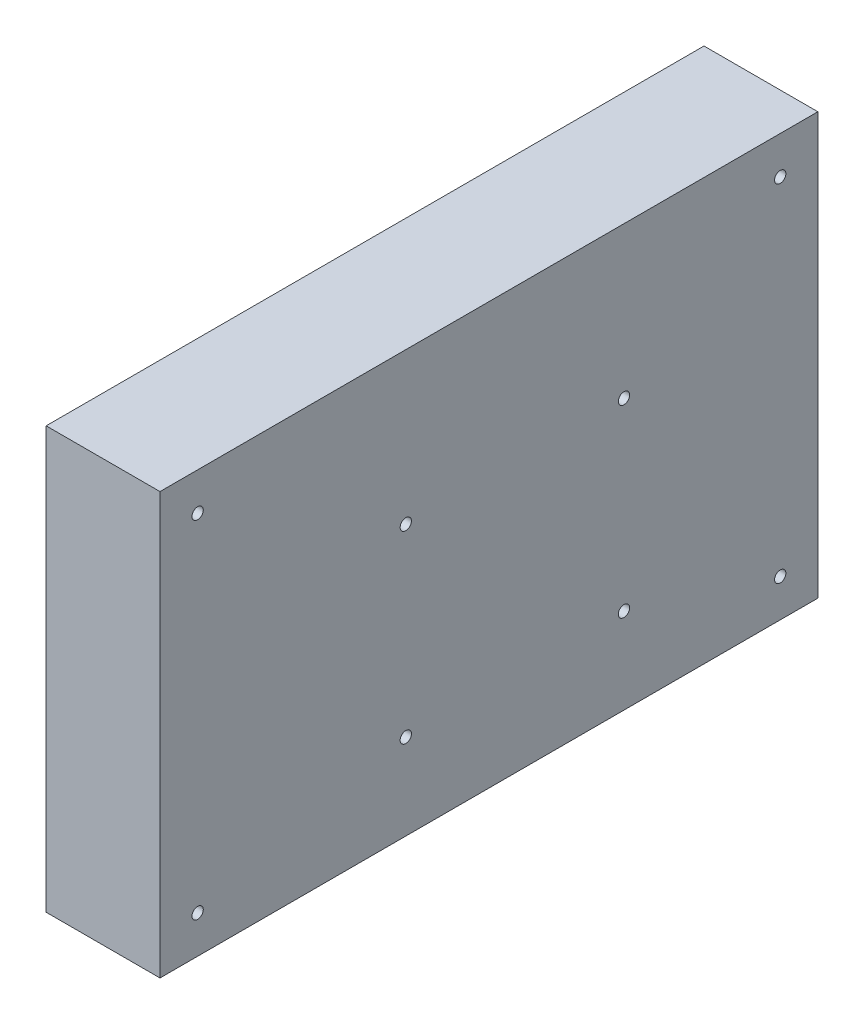
ISO-10303-21;
HEADER;
FILE_DESCRIPTION(('STEP AP214'),'2;1');
FILE_NAME('part.step','',(''),(''),'','','');
FILE_SCHEMA(('AUTOMOTIVE_DESIGN { 1 0 10303 214 1 1 1 1 }'));
ENDSEC;
DATA;
#1=APPLICATION_CONTEXT('core data for automotive mechanical design processes');
#2=APPLICATION_PROTOCOL_DEFINITION('international standard','automotive_design',2000,#1);
#3=PRODUCT_CONTEXT('',#1,'mechanical');
#4=PRODUCT('Part','Part','',(#3));
#5=PRODUCT_RELATED_PRODUCT_CATEGORY('part','',(#4));
#6=PRODUCT_DEFINITION_FORMATION('','',#4);
#7=PRODUCT_DEFINITION_CONTEXT('part definition',#1,'design');
#8=PRODUCT_DEFINITION('design','',#6,#7);
#9=PRODUCT_DEFINITION_SHAPE('','',#8);
#10=(LENGTH_UNIT() NAMED_UNIT(*) SI_UNIT(.MILLI.,.METRE.));
#11=(NAMED_UNIT(*) PLANE_ANGLE_UNIT() SI_UNIT($,.RADIAN.));
#12=(NAMED_UNIT(*) SI_UNIT($,.STERADIAN.) SOLID_ANGLE_UNIT());
#13=UNCERTAINTY_MEASURE_WITH_UNIT(LENGTH_MEASURE(1.E-05),#10,'distance_accuracy_value','');
#14=(GEOMETRIC_REPRESENTATION_CONTEXT(3) GLOBAL_UNCERTAINTY_ASSIGNED_CONTEXT((#13)) GLOBAL_UNIT_ASSIGNED_CONTEXT((#10,
#11,#12)) REPRESENTATION_CONTEXT('',''));
#15=CARTESIAN_POINT('',(0.,0.,0.));
#16=DIRECTION('',(0.,0.,1.));
#17=DIRECTION('',(1.,0.,0.));
#18=AXIS2_PLACEMENT_3D('',#15,#16,#17);
#19=CARTESIAN_POINT('',(29.27,46.,77.4450000000002));
#20=DIRECTION('',(-1.,0.,0.));
#21=DIRECTION('',(0.,0.,1.));
#22=AXIS2_PLACEMENT_3D('',#19,#20,#21);
#23=CYLINDRICAL_SURFACE('',#22,1.5);
#24=CARTESIAN_POINT('',(29.27,46.,77.4450000000002));
#25=DIRECTION('',(1.,0.,0.));
#26=DIRECTION('',(0.,0.,-1.));
#27=AXIS2_PLACEMENT_3D('',#24,#25,#26);
#28=CIRCLE('',#27,1.5);
#29=CARTESIAN_POINT('',(29.27,46.,75.9450000000002));
#30=VERTEX_POINT('',#29);
#31=EDGE_CURVE('E225',#30,#30,#28,.T.);
#32=ORIENTED_EDGE('',*,*,#31,.T.);
#33=EDGE_LOOP('',(#32));
#34=FACE_BOUND('',#33,.T.);
#35=CARTESIAN_POINT('',(25.27,46.,77.4450000000002));
#36=DIRECTION('',(-1.,0.,0.));
#37=DIRECTION('',(0.,0.,1.));
#38=AXIS2_PLACEMENT_3D('',#35,#36,#37);
#39=CIRCLE('',#38,1.5);
#40=CARTESIAN_POINT('',(25.27,46.,78.9450000000002));
#41=VERTEX_POINT('',#40);
#42=EDGE_CURVE('E194',#41,#41,#39,.T.);
#43=ORIENTED_EDGE('',*,*,#42,.T.);
#44=EDGE_LOOP('',(#43));
#45=FACE_BOUND('',#44,.T.);
#46=ADVANCED_FACE('F50',(#34,#45),#23,.F.);
#47=CARTESIAN_POINT('',(29.27,-46.,77.4450000000002));
#48=DIRECTION('',(-1.,0.,0.));
#49=DIRECTION('',(0.,0.,1.));
#50=AXIS2_PLACEMENT_3D('',#47,#48,#49);
#51=CYLINDRICAL_SURFACE('',#50,1.5);
#52=CARTESIAN_POINT('',(29.27,-46.,77.4450000000002));
#53=DIRECTION('',(1.,0.,0.));
#54=DIRECTION('',(0.,0.,-1.));
#55=AXIS2_PLACEMENT_3D('',#52,#53,#54);
#56=CIRCLE('',#55,1.5);
#57=CARTESIAN_POINT('',(29.27,-46.,75.9450000000002));
#58=VERTEX_POINT('',#57);
#59=EDGE_CURVE('E216',#58,#58,#56,.T.);
#60=ORIENTED_EDGE('',*,*,#59,.T.);
#61=EDGE_LOOP('',(#60));
#62=FACE_BOUND('',#61,.T.);
#63=CARTESIAN_POINT('',(25.27,-46.,77.4450000000002));
#64=DIRECTION('',(-1.,0.,0.));
#65=DIRECTION('',(0.,0.,1.));
#66=AXIS2_PLACEMENT_3D('',#63,#64,#65);
#67=CIRCLE('',#66,1.5);
#68=CARTESIAN_POINT('',(25.27,-46.,78.9450000000002));
#69=VERTEX_POINT('',#68);
#70=EDGE_CURVE('E190',#69,#69,#67,.T.);
#71=ORIENTED_EDGE('',*,*,#70,.T.);
#72=EDGE_LOOP('',(#71));
#73=FACE_BOUND('',#72,.T.);
#74=ADVANCED_FACE('F359',(#62,#73),#51,.F.);
#75=CARTESIAN_POINT('',(29.27,15.81,22.1));
#76=DIRECTION('',(-1.,0.,0.));
#77=DIRECTION('',(0.,0.,1.));
#78=AXIS2_PLACEMENT_3D('',#75,#76,#77);
#79=CYLINDRICAL_SURFACE('',#78,1.5);
#80=CARTESIAN_POINT('',(29.27,15.81,22.1));
#81=DIRECTION('',(1.,0.,0.));
#82=DIRECTION('',(0.,0.,-1.));
#83=AXIS2_PLACEMENT_3D('',#80,#81,#82);
#84=CIRCLE('',#83,1.5);
#85=CARTESIAN_POINT('',(29.27,15.81,20.6));
#86=VERTEX_POINT('',#85);
#87=EDGE_CURVE('E212',#86,#86,#84,.T.);
#88=ORIENTED_EDGE('',*,*,#87,.T.);
#89=EDGE_LOOP('',(#88));
#90=FACE_BOUND('',#89,.T.);
#91=CARTESIAN_POINT('',(25.27,15.81,22.1));
#92=DIRECTION('',(-1.,0.,0.));
#93=DIRECTION('',(0.,0.,1.));
#94=AXIS2_PLACEMENT_3D('',#91,#92,#93);
#95=CIRCLE('',#94,1.5);
#96=CARTESIAN_POINT('',(25.27,15.81,23.6));
#97=VERTEX_POINT('',#96);
#98=EDGE_CURVE('E182',#97,#97,#95,.T.);
#99=ORIENTED_EDGE('',*,*,#98,.T.);
#100=EDGE_LOOP('',(#99));
#101=FACE_BOUND('',#100,.T.);
#102=ADVANCED_FACE('F366',(#90,#101),#79,.F.);
#103=CARTESIAN_POINT('',(29.27,15.81,-35.8999999999999));
#104=DIRECTION('',(-1.,0.,0.));
#105=DIRECTION('',(0.,0.,1.));
#106=AXIS2_PLACEMENT_3D('',#103,#104,#105);
#107=CYLINDRICAL_SURFACE('',#106,1.5);
#108=CARTESIAN_POINT('',(29.27,15.81,-35.8999999999999));
#109=DIRECTION('',(1.,0.,0.));
#110=DIRECTION('',(0.,0.,-1.));
#111=AXIS2_PLACEMENT_3D('',#108,#109,#110);
#112=CIRCLE('',#111,1.5);
#113=CARTESIAN_POINT('',(29.27,15.81,-37.3999999999999));
#114=VERTEX_POINT('',#113);
#115=EDGE_CURVE('E214',#114,#114,#112,.T.);
#116=ORIENTED_EDGE('',*,*,#115,.T.);
#117=EDGE_LOOP('',(#116));
#118=FACE_BOUND('',#117,.T.);
#119=CARTESIAN_POINT('',(25.27,15.81,-35.8999999999999));
#120=DIRECTION('',(-1.,0.,0.));
#121=DIRECTION('',(0.,0.,1.));
#122=AXIS2_PLACEMENT_3D('',#119,#120,#121);
#123=CIRCLE('',#122,1.5);
#124=CARTESIAN_POINT('',(25.27,15.81,-34.3999999999999));
#125=VERTEX_POINT('',#124);
#126=EDGE_CURVE('E177',#125,#125,#123,.T.);
#127=ORIENTED_EDGE('',*,*,#126,.T.);
#128=EDGE_LOOP('',(#127));
#129=FACE_BOUND('',#128,.T.);
#130=ADVANCED_FACE('F444',(#118,#129),#107,.F.);
#131=CARTESIAN_POINT('',(29.27,-33.19,22.1));
#132=DIRECTION('',(-1.,0.,0.));
#133=DIRECTION('',(0.,0.,1.));
#134=AXIS2_PLACEMENT_3D('',#131,#132,#133);
#135=CYLINDRICAL_SURFACE('',#134,1.5);
#136=CARTESIAN_POINT('',(29.27,-33.19,22.1));
#137=DIRECTION('',(1.,0.,0.));
#138=DIRECTION('',(0.,0.,-1.));
#139=AXIS2_PLACEMENT_3D('',#136,#137,#138);
#140=CIRCLE('',#139,1.5);
#141=CARTESIAN_POINT('',(29.27,-33.19,20.6));
#142=VERTEX_POINT('',#141);
#143=EDGE_CURVE('E210',#142,#142,#140,.T.);
#144=ORIENTED_EDGE('',*,*,#143,.T.);
#145=EDGE_LOOP('',(#144));
#146=FACE_BOUND('',#145,.T.);
#147=CARTESIAN_POINT('',(25.27,-33.19,22.1));
#148=DIRECTION('',(-1.,0.,0.));
#149=DIRECTION('',(0.,0.,1.));
#150=AXIS2_PLACEMENT_3D('',#147,#148,#149);
#151=CIRCLE('',#150,1.5);
#152=CARTESIAN_POINT('',(25.27,-33.19,23.6));
#153=VERTEX_POINT('',#152);
#154=EDGE_CURVE('E174',#153,#153,#151,.T.);
#155=ORIENTED_EDGE('',*,*,#154,.T.);
#156=EDGE_LOOP('',(#155));
#157=FACE_BOUND('',#156,.T.);
#158=ADVANCED_FACE('F455',(#146,#157),#135,.F.);
#159=CARTESIAN_POINT('',(29.27,-33.19,-35.8999999999999));
#160=DIRECTION('',(-1.,0.,0.));
#161=DIRECTION('',(0.,0.,1.));
#162=AXIS2_PLACEMENT_3D('',#159,#160,#161);
#163=CYLINDRICAL_SURFACE('',#162,1.5);
#164=CARTESIAN_POINT('',(29.27,-33.19,-35.8999999999999));
#165=DIRECTION('',(1.,0.,0.));
#166=DIRECTION('',(0.,0.,-1.));
#167=AXIS2_PLACEMENT_3D('',#164,#165,#166);
#168=CIRCLE('',#167,1.5);
#169=CARTESIAN_POINT('',(29.27,-33.19,-37.3999999999999));
#170=VERTEX_POINT('',#169);
#171=EDGE_CURVE('E205',#170,#170,#168,.T.);
#172=ORIENTED_EDGE('',*,*,#171,.T.);
#173=EDGE_LOOP('',(#172));
#174=FACE_BOUND('',#173,.T.);
#175=CARTESIAN_POINT('',(25.27,-33.19,-35.8999999999999));
#176=DIRECTION('',(-1.,0.,0.));
#177=DIRECTION('',(0.,0.,1.));
#178=AXIS2_PLACEMENT_3D('',#175,#176,#177);
#179=CIRCLE('',#178,1.5);
#180=CARTESIAN_POINT('',(25.27,-33.19,-34.3999999999999));
#181=VERTEX_POINT('',#180);
#182=EDGE_CURVE('E171',#181,#181,#179,.T.);
#183=ORIENTED_EDGE('',*,*,#182,.T.);
#184=EDGE_LOOP('',(#183));
#185=FACE_BOUND('',#184,.T.);
#186=ADVANCED_FACE('F464',(#174,#185),#163,.F.);
#187=CARTESIAN_POINT('',(29.27,46.,-77.4449999999999));
#188=DIRECTION('',(-1.,0.,0.));
#189=DIRECTION('',(0.,0.,1.));
#190=AXIS2_PLACEMENT_3D('',#187,#188,#189);
#191=CYLINDRICAL_SURFACE('',#190,1.5);
#192=CARTESIAN_POINT('',(29.27,46.,-77.4449999999999));
#193=DIRECTION('',(1.,0.,0.));
#194=DIRECTION('',(0.,0.,-1.));
#195=AXIS2_PLACEMENT_3D('',#192,#193,#194);
#196=CIRCLE('',#195,1.5);
#197=CARTESIAN_POINT('',(29.27,46.,-78.9449999999999));
#198=VERTEX_POINT('',#197);
#199=EDGE_CURVE('E196',#198,#198,#196,.T.);
#200=ORIENTED_EDGE('',*,*,#199,.T.);
#201=EDGE_LOOP('',(#200));
#202=FACE_BOUND('',#201,.T.);
#203=CARTESIAN_POINT('',(25.27,46.,-77.4449999999999));
#204=DIRECTION('',(-1.,0.,0.));
#205=DIRECTION('',(0.,0.,1.));
#206=AXIS2_PLACEMENT_3D('',#203,#204,#205);
#207=CIRCLE('',#206,1.5);
#208=CARTESIAN_POINT('',(25.27,46.,-75.9449999999999));
#209=VERTEX_POINT('',#208);
#210=EDGE_CURVE('E170',#209,#209,#207,.T.);
#211=ORIENTED_EDGE('',*,*,#210,.T.);
#212=EDGE_LOOP('',(#211));
#213=FACE_BOUND('',#212,.T.);
#214=ADVANCED_FACE('F474',(#202,#213),#191,.F.);
#215=CARTESIAN_POINT('',(29.27,-46.,-77.4449999999999));
#216=DIRECTION('',(-1.,0.,0.));
#217=DIRECTION('',(0.,0.,1.));
#218=AXIS2_PLACEMENT_3D('',#215,#216,#217);
#219=CYLINDRICAL_SURFACE('',#218,1.49999999999995);
#220=CARTESIAN_POINT('',(29.27,-46.,-77.4449999999999));
#221=DIRECTION('',(1.,0.,0.));
#222=DIRECTION('',(0.,0.,-1.));
#223=AXIS2_PLACEMENT_3D('',#220,#221,#222);
#224=CIRCLE('',#223,1.49999999999995);
#225=CARTESIAN_POINT('',(29.27,-46.,-78.9449999999998));
#226=VERTEX_POINT('',#225);
#227=EDGE_CURVE('E192',#226,#226,#224,.T.);
#228=ORIENTED_EDGE('',*,*,#227,.T.);
#229=EDGE_LOOP('',(#228));
#230=FACE_BOUND('',#229,.T.);
#231=CARTESIAN_POINT('',(25.27,-46.,-77.4449999999999));
#232=DIRECTION('',(-1.,0.,0.));
#233=DIRECTION('',(0.,0.,1.));
#234=AXIS2_PLACEMENT_3D('',#231,#232,#233);
#235=CIRCLE('',#234,1.49999999999995);
#236=CARTESIAN_POINT('',(25.27,-46.,-75.9449999999999));
#237=VERTEX_POINT('',#236);
#238=EDGE_CURVE('E51',#237,#237,#235,.T.);
#239=ORIENTED_EDGE('',*,*,#238,.T.);
#240=EDGE_LOOP('',(#239));
#241=FACE_BOUND('',#240,.T.);
#242=ADVANCED_FACE('F478',(#230,#241),#219,.F.);
#243=CARTESIAN_POINT('',(14.27,56.,-87.45));
#244=DIRECTION('',(0.,0.,1.));
#245=DIRECTION('',(0.,-1.,0.));
#246=AXIS2_PLACEMENT_3D('',#243,#244,#245);
#247=PLANE('',#246);
#248=DIRECTION('',(-1.,0.,0.));
#249=VECTOR('',#248,1.);
#250=CARTESIAN_POINT('',(14.27,-56.,-87.45));
#251=LINE('',#250,#249);
#252=CARTESIAN_POINT('',(29.27,-56.,-87.45));
#253=VERTEX_POINT('',#252);
#254=CARTESIAN_POINT('',(-1.,-56.,-87.45));
#255=VERTEX_POINT('',#254);
#256=EDGE_CURVE('E324',#253,#255,#251,.T.);
#257=ORIENTED_EDGE('',*,*,#256,.T.);
#258=DIRECTION('',(0.,-1.,0.));
#259=VECTOR('',#258,1.);
#260=CARTESIAN_POINT('',(-1.,56.,-87.45));
#261=LINE('',#260,#259);
#262=CARTESIAN_POINT('',(-1.,56.,-87.45));
#263=VERTEX_POINT('',#262);
#264=EDGE_CURVE('E287',#263,#255,#261,.T.);
#265=ORIENTED_EDGE('',*,*,#264,.F.);
#266=DIRECTION('',(-1.,0.,0.));
#267=VECTOR('',#266,1.);
#268=CARTESIAN_POINT('',(14.27,56.,-87.45));
#269=LINE('',#268,#267);
#270=CARTESIAN_POINT('',(29.27,56.,-87.45));
#271=VERTEX_POINT('',#270);
#272=EDGE_CURVE('E11',#271,#263,#269,.T.);
#273=ORIENTED_EDGE('',*,*,#272,.F.);
#274=DIRECTION('',(0.,1.,0.));
#275=VECTOR('',#274,1.);
#276=CARTESIAN_POINT('',(29.27,56.,-87.45));
#277=LINE('',#276,#275);
#278=EDGE_CURVE('E232',#253,#271,#277,.T.);
#279=ORIENTED_EDGE('',*,*,#278,.F.);
#280=EDGE_LOOP('',(#257,#265,#273,#279));
#281=FACE_BOUND('',#280,.T.);
#282=ADVANCED_FACE('F47',(#281),#247,.F.);
#283=CARTESIAN_POINT('',(14.27,56.,-87.45));
#284=DIRECTION('',(0.,-1.,0.));
#285=DIRECTION('',(0.,0.,-1.));
#286=AXIS2_PLACEMENT_3D('',#283,#284,#285);
#287=PLANE('',#286);
#288=ORIENTED_EDGE('',*,*,#272,.T.);
#289=DIRECTION('',(0.,0.,-1.));
#290=VECTOR('',#289,1.);
#291=CARTESIAN_POINT('',(-1.,56.,-87.45));
#292=LINE('',#291,#290);
#293=CARTESIAN_POINT('',(-1.,56.,87.45));
#294=VERTEX_POINT('',#293);
#295=EDGE_CURVE('E296',#294,#263,#292,.T.);
#296=ORIENTED_EDGE('',*,*,#295,.F.);
#297=DIRECTION('',(-1.,0.,0.));
#298=VECTOR('',#297,1.);
#299=CARTESIAN_POINT('',(14.27,56.,87.45));
#300=LINE('',#299,#298);
#301=CARTESIAN_POINT('',(29.27,56.,87.45));
#302=VERTEX_POINT('',#301);
#303=EDGE_CURVE('E60',#302,#294,#300,.T.);
#304=ORIENTED_EDGE('',*,*,#303,.F.);
#305=DIRECTION('',(0.,0.,1.));
#306=VECTOR('',#305,1.);
#307=CARTESIAN_POINT('',(29.27,56.,87.45));
#308=LINE('',#307,#306);
#309=EDGE_CURVE('E237',#271,#302,#308,.T.);
#310=ORIENTED_EDGE('',*,*,#309,.F.);
#311=EDGE_LOOP('',(#288,#296,#304,#310));
#312=FACE_BOUND('',#311,.T.);
#313=ADVANCED_FACE('F338',(#312),#287,.F.);
#314=CARTESIAN_POINT('',(14.27,56.,87.45));
#315=DIRECTION('',(0.,0.,-1.));
#316=DIRECTION('',(0.,1.,0.));
#317=AXIS2_PLACEMENT_3D('',#314,#315,#316);
#318=PLANE('',#317);
#319=ORIENTED_EDGE('',*,*,#303,.T.);
#320=DIRECTION('',(0.,1.,0.));
#321=VECTOR('',#320,1.);
#322=CARTESIAN_POINT('',(-1.,56.,87.45));
#323=LINE('',#322,#321);
#324=CARTESIAN_POINT('',(-1.,-56.,87.45));
#325=VERTEX_POINT('',#324);
#326=EDGE_CURVE('E295',#325,#294,#323,.T.);
#327=ORIENTED_EDGE('',*,*,#326,.F.);
#328=DIRECTION('',(-1.,0.,0.));
#329=VECTOR('',#328,1.);
#330=CARTESIAN_POINT('',(14.27,-56.,87.45));
#331=LINE('',#330,#329);
#332=CARTESIAN_POINT('',(29.27,-56.,87.45));
#333=VERTEX_POINT('',#332);
#334=EDGE_CURVE('E323',#333,#325,#331,.T.);
#335=ORIENTED_EDGE('',*,*,#334,.F.);
#336=DIRECTION('',(0.,-1.,0.));
#337=VECTOR('',#336,1.);
#338=CARTESIAN_POINT('',(29.27,56.,87.45));
#339=LINE('',#338,#337);
#340=EDGE_CURVE('E227',#302,#333,#339,.T.);
#341=ORIENTED_EDGE('',*,*,#340,.F.);
#342=EDGE_LOOP('',(#319,#327,#335,#341));
#343=FACE_BOUND('',#342,.T.);
#344=ADVANCED_FACE('F332',(#343),#318,.F.);
#345=CARTESIAN_POINT('',(14.27,-56.,-87.45));
#346=DIRECTION('',(0.,1.,0.));
#347=DIRECTION('',(0.,0.,1.));
#348=AXIS2_PLACEMENT_3D('',#345,#346,#347);
#349=PLANE('',#348);
#350=ORIENTED_EDGE('',*,*,#334,.T.);
#351=DIRECTION('',(0.,0.,1.));
#352=VECTOR('',#351,1.);
#353=CARTESIAN_POINT('',(-1.,-56.,-87.45));
#354=LINE('',#353,#352);
#355=EDGE_CURVE('E288',#255,#325,#354,.T.);
#356=ORIENTED_EDGE('',*,*,#355,.F.);
#357=ORIENTED_EDGE('',*,*,#256,.F.);
#358=DIRECTION('',(0.,0.,-1.));
#359=VECTOR('',#358,1.);
#360=CARTESIAN_POINT('',(29.27,-56.,87.45));
#361=LINE('',#360,#359);
#362=EDGE_CURVE('E233',#333,#253,#361,.T.);
#363=ORIENTED_EDGE('',*,*,#362,.F.);
#364=EDGE_LOOP('',(#350,#356,#357,#363));
#365=FACE_BOUND('',#364,.T.);
#366=ADVANCED_FACE('F349',(#365),#349,.F.);
#367=CARTESIAN_POINT('',(14.27,52.,-83.45));
#368=DIRECTION('',(0.,0.,1.));
#369=DIRECTION('',(0.,-1.,0.));
#370=AXIS2_PLACEMENT_3D('',#367,#368,#369);
#371=PLANE('',#370);
#372=DIRECTION('',(0.,1.,0.));
#373=VECTOR('',#372,1.);
#374=CARTESIAN_POINT('',(0.,52.,-83.45));
#375=LINE('',#374,#373);
#376=CARTESIAN_POINT('',(0.,-52.,-83.45));
#377=VERTEX_POINT('',#376);
#378=CARTESIAN_POINT('',(0.,52.,-83.45));
#379=VERTEX_POINT('',#378);
#380=EDGE_CURVE('E63',#377,#379,#375,.T.);
#381=ORIENTED_EDGE('',*,*,#380,.F.);
#382=DIRECTION('',(-1.,0.,0.));
#383=VECTOR('',#382,1.);
#384=CARTESIAN_POINT('',(14.27,-52.,-83.45));
#385=LINE('',#384,#383);
#386=CARTESIAN_POINT('',(25.27,-52.,-83.45));
#387=VERTEX_POINT('',#386);
#388=EDGE_CURVE('E137',#387,#377,#385,.T.);
#389=ORIENTED_EDGE('',*,*,#388,.F.);
#390=DIRECTION('',(0.,-1.,0.));
#391=VECTOR('',#390,1.);
#392=CARTESIAN_POINT('',(25.27,52.,-83.45));
#393=LINE('',#392,#391);
#394=CARTESIAN_POINT('',(25.27,52.,-83.45));
#395=VERTEX_POINT('',#394);
#396=EDGE_CURVE('E138',#395,#387,#393,.T.);
#397=ORIENTED_EDGE('',*,*,#396,.F.);
#398=DIRECTION('',(-1.,0.,0.));
#399=VECTOR('',#398,1.);
#400=CARTESIAN_POINT('',(14.27,52.,-83.45));
#401=LINE('',#400,#399);
#402=EDGE_CURVE('E319',#395,#379,#401,.T.);
#403=ORIENTED_EDGE('',*,*,#402,.T.);
#404=EDGE_LOOP('',(#381,#389,#397,#403));
#405=FACE_BOUND('',#404,.T.);
#406=ADVANCED_FACE('F140',(#405),#371,.T.);
#407=CARTESIAN_POINT('',(14.27,52.,-83.45));
#408=DIRECTION('',(0.,-1.,0.));
#409=DIRECTION('',(0.,0.,-1.));
#410=AXIS2_PLACEMENT_3D('',#407,#408,#409);
#411=PLANE('',#410);
#412=DIRECTION('',(0.,0.,1.));
#413=VECTOR('',#412,1.);
#414=CARTESIAN_POINT('',(0.,52.,-83.45));
#415=LINE('',#414,#413);
#416=CARTESIAN_POINT('',(0.,52.,83.45));
#417=VERTEX_POINT('',#416);
#418=EDGE_CURVE('E302',#379,#417,#415,.T.);
#419=ORIENTED_EDGE('',*,*,#418,.F.);
#420=ORIENTED_EDGE('',*,*,#402,.F.);
#421=DIRECTION('',(0.,0.,-1.));
#422=VECTOR('',#421,1.);
#423=CARTESIAN_POINT('',(25.27,52.,-83.45));
#424=LINE('',#423,#422);
#425=CARTESIAN_POINT('',(25.27,52.,83.45));
#426=VERTEX_POINT('',#425);
#427=EDGE_CURVE('E156',#426,#395,#424,.T.);
#428=ORIENTED_EDGE('',*,*,#427,.F.);
#429=DIRECTION('',(-1.,0.,0.));
#430=VECTOR('',#429,1.);
#431=CARTESIAN_POINT('',(14.27,52.,83.45));
#432=LINE('',#431,#430);
#433=EDGE_CURVE('E74',#426,#417,#432,.T.);
#434=ORIENTED_EDGE('',*,*,#433,.T.);
#435=EDGE_LOOP('',(#419,#420,#428,#434));
#436=FACE_BOUND('',#435,.T.);
#437=ADVANCED_FACE('F358',(#436),#411,.T.);
#438=CARTESIAN_POINT('',(14.27,52.,83.45));
#439=DIRECTION('',(0.,0.,-1.));
#440=DIRECTION('',(0.,1.,0.));
#441=AXIS2_PLACEMENT_3D('',#438,#439,#440);
#442=PLANE('',#441);
#443=DIRECTION('',(0.,-1.,0.));
#444=VECTOR('',#443,1.);
#445=CARTESIAN_POINT('',(0.,52.,83.45));
#446=LINE('',#445,#444);
#447=CARTESIAN_POINT('',(0.,-52.,83.45));
#448=VERTEX_POINT('',#447);
#449=EDGE_CURVE('E308',#417,#448,#446,.T.);
#450=ORIENTED_EDGE('',*,*,#449,.F.);
#451=ORIENTED_EDGE('',*,*,#433,.F.);
#452=DIRECTION('',(0.,1.,0.));
#453=VECTOR('',#452,1.);
#454=CARTESIAN_POINT('',(25.27,52.,83.45));
#455=LINE('',#454,#453);
#456=CARTESIAN_POINT('',(25.27,-52.,83.45));
#457=VERTEX_POINT('',#456);
#458=EDGE_CURVE('E157',#457,#426,#455,.T.);
#459=ORIENTED_EDGE('',*,*,#458,.F.);
#460=DIRECTION('',(-1.,0.,0.));
#461=VECTOR('',#460,1.);
#462=CARTESIAN_POINT('',(14.27,-52.,83.45));
#463=LINE('',#462,#461);
#464=EDGE_CURVE('E143',#457,#448,#463,.T.);
#465=ORIENTED_EDGE('',*,*,#464,.T.);
#466=EDGE_LOOP('',(#450,#451,#459,#465));
#467=FACE_BOUND('',#466,.T.);
#468=ADVANCED_FACE('F400',(#467),#442,.T.);
#469=CARTESIAN_POINT('',(14.27,-52.,-83.45));
#470=DIRECTION('',(0.,1.,0.));
#471=DIRECTION('',(0.,0.,1.));
#472=AXIS2_PLACEMENT_3D('',#469,#470,#471);
#473=PLANE('',#472);
#474=DIRECTION('',(0.,0.,-1.));
#475=VECTOR('',#474,1.);
#476=CARTESIAN_POINT('',(0.,-52.,-83.45));
#477=LINE('',#476,#475);
#478=EDGE_CURVE('E149',#448,#377,#477,.T.);
#479=ORIENTED_EDGE('',*,*,#478,.F.);
#480=ORIENTED_EDGE('',*,*,#464,.F.);
#481=DIRECTION('',(0.,0.,1.));
#482=VECTOR('',#481,1.);
#483=CARTESIAN_POINT('',(25.27,-52.,-83.45));
#484=LINE('',#483,#482);
#485=EDGE_CURVE('E148',#387,#457,#484,.T.);
#486=ORIENTED_EDGE('',*,*,#485,.F.);
#487=ORIENTED_EDGE('',*,*,#388,.T.);
#488=EDGE_LOOP('',(#479,#480,#486,#487));
#489=FACE_BOUND('',#488,.T.);
#490=ADVANCED_FACE('F147',(#489),#473,.T.);
#491=CARTESIAN_POINT('',(0.,0.,0.));
#492=DIRECTION('',(-1.,0.,0.));
#493=DIRECTION('',(0.,0.,1.));
#494=AXIS2_PLACEMENT_3D('',#491,#492,#493);
#495=PLANE('',#494);
#496=DIRECTION('',(0.,-1.,0.));
#497=VECTOR('',#496,1.);
#498=CARTESIAN_POINT('',(0.,49.125,-80.45));
#499=LINE('',#498,#497);
#500=CARTESIAN_POINT('',(0.,49.125,-80.45));
#501=VERTEX_POINT('',#500);
#502=CARTESIAN_POINT('',(0.,-49.249406291834,-80.45));
#503=VERTEX_POINT('',#502);
#504=EDGE_CURVE('E243',#501,#503,#499,.T.);
#505=ORIENTED_EDGE('',*,*,#504,.T.);
#506=DIRECTION('',(0.,0.,1.));
#507=VECTOR('',#506,1.);
#508=CARTESIAN_POINT('',(0.,-49.249406291834,-80.45));
#509=LINE('',#508,#507);
#510=CARTESIAN_POINT('',(0.,-49.249406291834,80.45));
#511=VERTEX_POINT('',#510);
#512=EDGE_CURVE('E265',#503,#511,#509,.T.);
#513=ORIENTED_EDGE('',*,*,#512,.T.);
#514=DIRECTION('',(0.,1.,0.));
#515=VECTOR('',#514,1.);
#516=CARTESIAN_POINT('',(0.,49.125,80.45));
#517=LINE('',#516,#515);
#518=CARTESIAN_POINT('',(0.,49.125,80.45));
#519=VERTEX_POINT('',#518);
#520=EDGE_CURVE('E267',#511,#519,#517,.T.);
#521=ORIENTED_EDGE('',*,*,#520,.T.);
#522=DIRECTION('',(0.,0.,-1.));
#523=VECTOR('',#522,1.);
#524=CARTESIAN_POINT('',(0.,49.125,-80.45));
#525=LINE('',#524,#523);
#526=EDGE_CURVE('E247',#519,#501,#525,.T.);
#527=ORIENTED_EDGE('',*,*,#526,.T.);
#528=EDGE_LOOP('',(#505,#513,#521,#527));
#529=FACE_BOUND('',#528,.T.);
#530=ORIENTED_EDGE('',*,*,#449,.T.);
#531=ORIENTED_EDGE('',*,*,#478,.T.);
#532=ORIENTED_EDGE('',*,*,#380,.T.);
#533=ORIENTED_EDGE('',*,*,#418,.T.);
#534=EDGE_LOOP('',(#530,#531,#532,#533));
#535=FACE_BOUND('',#534,.T.);
#536=ADVANCED_FACE('F395',(#529,#535),#495,.F.);
#537=CARTESIAN_POINT('',(-1.,0.,0.));
#538=DIRECTION('',(-1.,0.,0.));
#539=DIRECTION('',(0.,0.,1.));
#540=AXIS2_PLACEMENT_3D('',#537,#538,#539);
#541=PLANE('',#540);
#542=ORIENTED_EDGE('',*,*,#264,.T.);
#543=ORIENTED_EDGE('',*,*,#355,.T.);
#544=ORIENTED_EDGE('',*,*,#326,.T.);
#545=ORIENTED_EDGE('',*,*,#295,.T.);
#546=EDGE_LOOP('',(#542,#543,#544,#545));
#547=FACE_BOUND('',#546,.T.);
#548=DIRECTION('',(0.,0.,1.));
#549=VECTOR('',#548,1.);
#550=CARTESIAN_POINT('',(-1.,-49.249406291834,-80.45));
#551=LINE('',#550,#549);
#552=CARTESIAN_POINT('',(-1.,-49.249406291834,-80.45));
#553=VERTEX_POINT('',#552);
#554=CARTESIAN_POINT('',(-1.,-49.249406291834,80.45));
#555=VERTEX_POINT('',#554);
#556=EDGE_CURVE('E250',#553,#555,#551,.T.);
#557=ORIENTED_EDGE('',*,*,#556,.F.);
#558=DIRECTION('',(0.,-1.,0.));
#559=VECTOR('',#558,1.);
#560=CARTESIAN_POINT('',(-1.,49.125,-80.45));
#561=LINE('',#560,#559);
#562=CARTESIAN_POINT('',(-1.,49.125,-80.45));
#563=VERTEX_POINT('',#562);
#564=EDGE_CURVE('E242',#563,#553,#561,.T.);
#565=ORIENTED_EDGE('',*,*,#564,.F.);
#566=DIRECTION('',(0.,0.,-1.));
#567=VECTOR('',#566,1.);
#568=CARTESIAN_POINT('',(-1.,49.125,-80.45));
#569=LINE('',#568,#567);
#570=CARTESIAN_POINT('',(-1.,49.125,80.45));
#571=VERTEX_POINT('',#570);
#572=EDGE_CURVE('E253',#571,#563,#569,.T.);
#573=ORIENTED_EDGE('',*,*,#572,.F.);
#574=DIRECTION('',(0.,1.,0.));
#575=VECTOR('',#574,1.);
#576=CARTESIAN_POINT('',(-1.,49.125,80.45));
#577=LINE('',#576,#575);
#578=EDGE_CURVE('E252',#555,#571,#577,.T.);
#579=ORIENTED_EDGE('',*,*,#578,.F.);
#580=EDGE_LOOP('',(#557,#565,#573,#579));
#581=FACE_BOUND('',#580,.T.);
#582=ADVANCED_FACE('F337',(#547,#581),#541,.T.);
#583=CARTESIAN_POINT('',(-1.,49.125,-80.45));
#584=DIRECTION('',(0.,0.,1.));
#585=DIRECTION('',(0.,-1.,0.));
#586=AXIS2_PLACEMENT_3D('',#583,#584,#585);
#587=PLANE('',#586);
#588=ORIENTED_EDGE('',*,*,#504,.F.);
#589=DIRECTION('',(1.,0.,0.));
#590=VECTOR('',#589,1.);
#591=CARTESIAN_POINT('',(-1.,49.125,-80.45));
#592=LINE('',#591,#590);
#593=EDGE_CURVE('E260',#563,#501,#592,.T.);
#594=ORIENTED_EDGE('',*,*,#593,.F.);
#595=ORIENTED_EDGE('',*,*,#564,.T.);
#596=DIRECTION('',(1.,0.,0.));
#597=VECTOR('',#596,1.);
#598=CARTESIAN_POINT('',(-1.,-49.249406291834,-80.45));
#599=LINE('',#598,#597);
#600=EDGE_CURVE('E285',#553,#503,#599,.T.);
#601=ORIENTED_EDGE('',*,*,#600,.T.);
#602=EDGE_LOOP('',(#588,#594,#595,#601));
#603=FACE_BOUND('',#602,.T.);
#604=ADVANCED_FACE('F383',(#603),#587,.T.);
#605=CARTESIAN_POINT('',(-1.,-49.249406291834,-80.45));
#606=DIRECTION('',(0.,1.,0.));
#607=DIRECTION('',(0.,0.,1.));
#608=AXIS2_PLACEMENT_3D('',#605,#606,#607);
#609=PLANE('',#608);
#610=ORIENTED_EDGE('',*,*,#512,.F.);
#611=ORIENTED_EDGE('',*,*,#600,.F.);
#612=ORIENTED_EDGE('',*,*,#556,.T.);
#613=DIRECTION('',(1.,0.,0.));
#614=VECTOR('',#613,1.);
#615=CARTESIAN_POINT('',(-1.,-49.249406291834,80.45));
#616=LINE('',#615,#614);
#617=EDGE_CURVE('E278',#555,#511,#616,.T.);
#618=ORIENTED_EDGE('',*,*,#617,.T.);
#619=EDGE_LOOP('',(#610,#611,#612,#618));
#620=FACE_BOUND('',#619,.T.);
#621=ADVANCED_FACE('F382',(#620),#609,.T.);
#622=CARTESIAN_POINT('',(-1.,49.125,80.45));
#623=DIRECTION('',(0.,0.,-1.));
#624=DIRECTION('',(0.,1.,0.));
#625=AXIS2_PLACEMENT_3D('',#622,#623,#624);
#626=PLANE('',#625);
#627=ORIENTED_EDGE('',*,*,#520,.F.);
#628=ORIENTED_EDGE('',*,*,#617,.F.);
#629=ORIENTED_EDGE('',*,*,#578,.T.);
#630=DIRECTION('',(1.,0.,0.));
#631=VECTOR('',#630,1.);
#632=CARTESIAN_POINT('',(-1.,49.125,80.45));
#633=LINE('',#632,#631);
#634=EDGE_CURVE('E279',#571,#519,#633,.T.);
#635=ORIENTED_EDGE('',*,*,#634,.T.);
#636=EDGE_LOOP('',(#627,#628,#629,#635));
#637=FACE_BOUND('',#636,.T.);
#638=ADVANCED_FACE('F380',(#637),#626,.T.);
#639=CARTESIAN_POINT('',(-1.,49.125,-80.45));
#640=DIRECTION('',(0.,-1.,0.));
#641=DIRECTION('',(0.,0.,-1.));
#642=AXIS2_PLACEMENT_3D('',#639,#640,#641);
#643=PLANE('',#642);
#644=ORIENTED_EDGE('',*,*,#526,.F.);
#645=ORIENTED_EDGE('',*,*,#634,.F.);
#646=ORIENTED_EDGE('',*,*,#572,.T.);
#647=ORIENTED_EDGE('',*,*,#593,.T.);
#648=EDGE_LOOP('',(#644,#645,#646,#647));
#649=FACE_BOUND('',#648,.T.);
#650=ADVANCED_FACE('F373',(#649),#643,.T.);
#651=CARTESIAN_POINT('',(29.27,0.,0.));
#652=DIRECTION('',(1.,0.,0.));
#653=DIRECTION('',(0.,0.,-1.));
#654=AXIS2_PLACEMENT_3D('',#651,#652,#653);
#655=PLANE('',#654);
#656=ORIENTED_EDGE('',*,*,#199,.F.);
#657=EDGE_LOOP('',(#656));
#658=FACE_BOUND('',#657,.T.);
#659=ORIENTED_EDGE('',*,*,#143,.F.);
#660=EDGE_LOOP('',(#659));
#661=FACE_BOUND('',#660,.T.);
#662=ORIENTED_EDGE('',*,*,#87,.F.);
#663=EDGE_LOOP('',(#662));
#664=FACE_BOUND('',#663,.T.);
#665=ORIENTED_EDGE('',*,*,#31,.F.);
#666=EDGE_LOOP('',(#665));
#667=FACE_BOUND('',#666,.T.);
#668=ORIENTED_EDGE('',*,*,#340,.T.);
#669=ORIENTED_EDGE('',*,*,#362,.T.);
#670=ORIENTED_EDGE('',*,*,#278,.T.);
#671=ORIENTED_EDGE('',*,*,#309,.T.);
#672=EDGE_LOOP('',(#668,#669,#670,#671));
#673=FACE_BOUND('',#672,.T.);
#674=ORIENTED_EDGE('',*,*,#59,.F.);
#675=EDGE_LOOP('',(#674));
#676=FACE_BOUND('',#675,.T.);
#677=ORIENTED_EDGE('',*,*,#115,.F.);
#678=EDGE_LOOP('',(#677));
#679=FACE_BOUND('',#678,.T.);
#680=ORIENTED_EDGE('',*,*,#171,.F.);
#681=EDGE_LOOP('',(#680));
#682=FACE_BOUND('',#681,.T.);
#683=ORIENTED_EDGE('',*,*,#227,.F.);
#684=EDGE_LOOP('',(#683));
#685=FACE_BOUND('',#684,.T.);
#686=ADVANCED_FACE('F343',(#658,#661,#664,#667,#673,#676,#679,#682,#685),#655,.T.);
#687=CARTESIAN_POINT('',(25.27,0.,0.));
#688=DIRECTION('',(-1.,0.,0.));
#689=DIRECTION('',(0.,0.,1.));
#690=AXIS2_PLACEMENT_3D('',#687,#688,#689);
#691=PLANE('',#690);
#692=ORIENTED_EDGE('',*,*,#42,.F.);
#693=EDGE_LOOP('',(#692));
#694=FACE_BOUND('',#693,.T.);
#695=ORIENTED_EDGE('',*,*,#70,.F.);
#696=EDGE_LOOP('',(#695));
#697=FACE_BOUND('',#696,.T.);
#698=ORIENTED_EDGE('',*,*,#98,.F.);
#699=EDGE_LOOP('',(#698));
#700=FACE_BOUND('',#699,.T.);
#701=ORIENTED_EDGE('',*,*,#126,.F.);
#702=EDGE_LOOP('',(#701));
#703=FACE_BOUND('',#702,.T.);
#704=ORIENTED_EDGE('',*,*,#154,.F.);
#705=EDGE_LOOP('',(#704));
#706=FACE_BOUND('',#705,.T.);
#707=ORIENTED_EDGE('',*,*,#182,.F.);
#708=EDGE_LOOP('',(#707));
#709=FACE_BOUND('',#708,.T.);
#710=ORIENTED_EDGE('',*,*,#210,.F.);
#711=EDGE_LOOP('',(#710));
#712=FACE_BOUND('',#711,.T.);
#713=ORIENTED_EDGE('',*,*,#238,.F.);
#714=EDGE_LOOP('',(#713));
#715=FACE_BOUND('',#714,.T.);
#716=ORIENTED_EDGE('',*,*,#396,.T.);
#717=ORIENTED_EDGE('',*,*,#485,.T.);
#718=ORIENTED_EDGE('',*,*,#458,.T.);
#719=ORIENTED_EDGE('',*,*,#427,.T.);
#720=EDGE_LOOP('',(#716,#717,#718,#719));
#721=FACE_BOUND('',#720,.T.);
#722=ADVANCED_FACE('F160',(#694,#697,#700,#703,#706,#709,#712,#715,#721),#691,.T.);
#723=CLOSED_SHELL('',(#46,#74,#102,#130,#158,#186,#214,#242,#282,#313,#344,#366,#406,#437,#468,
#490,#536,#582,#604,#621,#638,#650,#686,#722));
#724=MANIFOLD_SOLID_BREP('B2',#723);
#725=ADVANCED_BREP_SHAPE_REPRESENTATION('',(#18,#724),#14);
#726=SHAPE_DEFINITION_REPRESENTATION(#9,#725);
ENDSEC;
END-ISO-10303-21;
